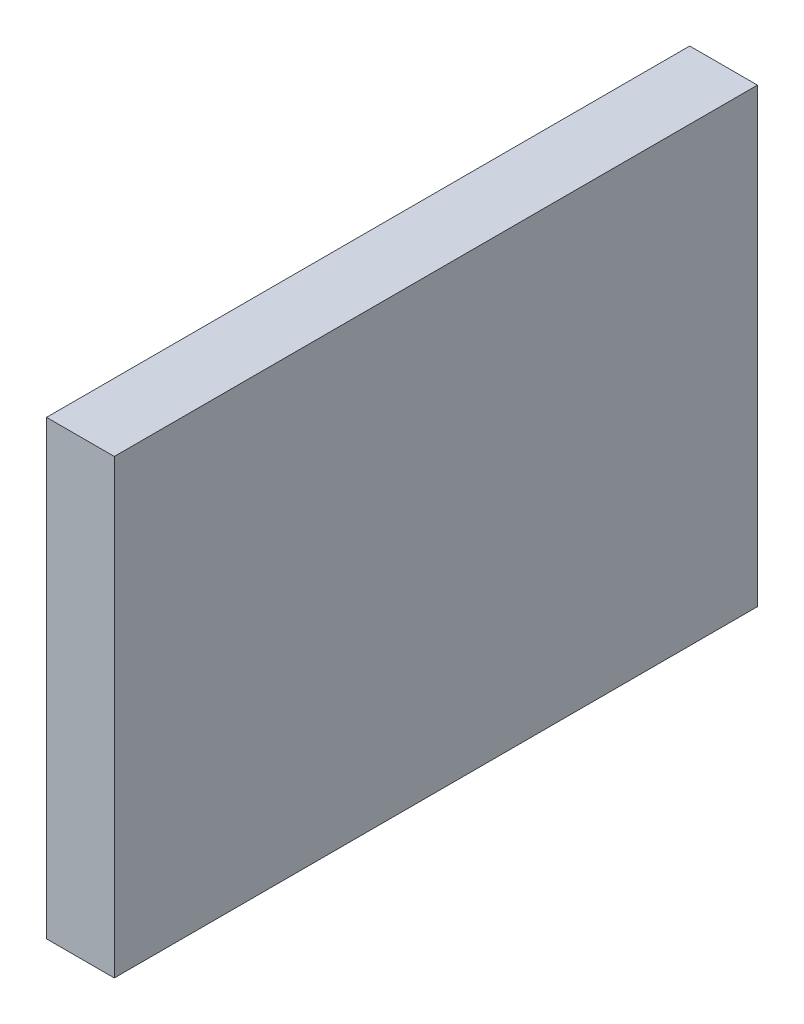
ISO-10303-21;
HEADER;
FILE_DESCRIPTION(('STEP AP214'),'2;1');
FILE_NAME('part.step','',(''),(''),'','','');
FILE_SCHEMA(('AUTOMOTIVE_DESIGN { 1 0 10303 214 1 1 1 1 }'));
ENDSEC;
DATA;
#1=APPLICATION_CONTEXT('core data for automotive mechanical design processes');
#2=APPLICATION_PROTOCOL_DEFINITION('international standard','automotive_design',2000,#1);
#3=PRODUCT_CONTEXT('',#1,'mechanical');
#4=PRODUCT('Part','Part','',(#3));
#5=PRODUCT_RELATED_PRODUCT_CATEGORY('part','',(#4));
#6=PRODUCT_DEFINITION_FORMATION('','',#4);
#7=PRODUCT_DEFINITION_CONTEXT('part definition',#1,'design');
#8=PRODUCT_DEFINITION('design','',#6,#7);
#9=PRODUCT_DEFINITION_SHAPE('','',#8);
#10=(LENGTH_UNIT() NAMED_UNIT(*) SI_UNIT(.MILLI.,.METRE.));
#11=(NAMED_UNIT(*) PLANE_ANGLE_UNIT() SI_UNIT($,.RADIAN.));
#12=(NAMED_UNIT(*) SI_UNIT($,.STERADIAN.) SOLID_ANGLE_UNIT());
#13=UNCERTAINTY_MEASURE_WITH_UNIT(LENGTH_MEASURE(1.E-05),#10,'distance_accuracy_value','');
#14=(GEOMETRIC_REPRESENTATION_CONTEXT(3) GLOBAL_UNCERTAINTY_ASSIGNED_CONTEXT((#13)) GLOBAL_UNIT_ASSIGNED_CONTEXT((#10,
#11,#12)) REPRESENTATION_CONTEXT('',''));
#15=CARTESIAN_POINT('',(0.,0.,0.));
#16=DIRECTION('',(0.,0.,1.));
#17=DIRECTION('',(1.,0.,0.));
#18=AXIS2_PLACEMENT_3D('',#15,#16,#17);
#19=CARTESIAN_POINT('',(15.,0.,0.));
#20=DIRECTION('',(0.,0.,-1.));
#21=DIRECTION('',(-1.,0.,0.));
#22=AXIS2_PLACEMENT_3D('',#19,#20,#21);
#23=PLANE('',#22);
#24=DIRECTION('',(0.,-1.,0.));
#25=VECTOR('',#24,1.);
#26=CARTESIAN_POINT('',(0.,0.,0.));
#27=LINE('',#26,#25);
#28=CARTESIAN_POINT('',(0.,100.,0.));
#29=VERTEX_POINT('',#28);
#30=CARTESIAN_POINT('',(0.,0.,0.));
#31=VERTEX_POINT('',#30);
#32=EDGE_CURVE('E96',#29,#31,#27,.T.);
#33=ORIENTED_EDGE('',*,*,#32,.T.);
#34=DIRECTION('',(-1.,0.,0.));
#35=VECTOR('',#34,1.);
#36=CARTESIAN_POINT('',(15.,0.,0.));
#37=LINE('',#36,#35);
#38=CARTESIAN_POINT('',(15.,0.,0.));
#39=VERTEX_POINT('',#38);
#40=EDGE_CURVE('E11',#39,#31,#37,.T.);
#41=ORIENTED_EDGE('',*,*,#40,.F.);
#42=DIRECTION('',(0.,-1.,0.));
#43=VECTOR('',#42,1.);
#44=CARTESIAN_POINT('',(15.,0.,0.));
#45=LINE('',#44,#43);
#46=CARTESIAN_POINT('',(15.,100.,0.));
#47=VERTEX_POINT('',#46);
#48=EDGE_CURVE('E84',#47,#39,#45,.T.);
#49=ORIENTED_EDGE('',*,*,#48,.F.);
#50=DIRECTION('',(-1.,0.,0.));
#51=VECTOR('',#50,1.);
#52=CARTESIAN_POINT('',(15.,100.,0.));
#53=LINE('',#52,#51);
#54=EDGE_CURVE('E92',#47,#29,#53,.T.);
#55=ORIENTED_EDGE('',*,*,#54,.T.);
#56=EDGE_LOOP('',(#33,#41,#49,#55));
#57=FACE_BOUND('',#56,.T.);
#58=ADVANCED_FACE('F33',(#57),#23,.F.);
#59=CARTESIAN_POINT('',(15.,0.,0.));
#60=DIRECTION('',(0.,1.,0.));
#61=DIRECTION('',(0.,0.,1.));
#62=AXIS2_PLACEMENT_3D('',#59,#60,#61);
#63=PLANE('',#62);
#64=DIRECTION('',(0.,0.,-1.));
#65=VECTOR('',#64,1.);
#66=CARTESIAN_POINT('',(0.,0.,0.));
#67=LINE('',#66,#65);
#68=CARTESIAN_POINT('',(0.,0.,-142.4));
#69=VERTEX_POINT('',#68);
#70=EDGE_CURVE('E88',#31,#69,#67,.T.);
#71=ORIENTED_EDGE('',*,*,#70,.T.);
#72=DIRECTION('',(-1.,0.,0.));
#73=VECTOR('',#72,1.);
#74=CARTESIAN_POINT('',(15.,0.,-142.4));
#75=LINE('',#74,#73);
#76=CARTESIAN_POINT('',(15.,0.,-142.4));
#77=VERTEX_POINT('',#76);
#78=EDGE_CURVE('E41',#77,#69,#75,.T.);
#79=ORIENTED_EDGE('',*,*,#78,.F.);
#80=DIRECTION('',(0.,0.,-1.));
#81=VECTOR('',#80,1.);
#82=CARTESIAN_POINT('',(15.,0.,0.));
#83=LINE('',#82,#81);
#84=EDGE_CURVE('E79',#39,#77,#83,.T.);
#85=ORIENTED_EDGE('',*,*,#84,.F.);
#86=ORIENTED_EDGE('',*,*,#40,.T.);
#87=EDGE_LOOP('',(#71,#79,#85,#86));
#88=FACE_BOUND('',#87,.T.);
#89=ADVANCED_FACE('F87',(#88),#63,.F.);
#90=CARTESIAN_POINT('',(15.,0.,-142.4));
#91=DIRECTION('',(0.,0.,1.));
#92=DIRECTION('',(1.,0.,0.));
#93=AXIS2_PLACEMENT_3D('',#90,#91,#92);
#94=PLANE('',#93);
#95=DIRECTION('',(0.,1.,0.));
#96=VECTOR('',#95,1.);
#97=CARTESIAN_POINT('',(0.,0.,-142.4));
#98=LINE('',#97,#96);
#99=CARTESIAN_POINT('',(0.,100.,-142.4));
#100=VERTEX_POINT('',#99);
#101=EDGE_CURVE('E66',#69,#100,#98,.T.);
#102=ORIENTED_EDGE('',*,*,#101,.T.);
#103=DIRECTION('',(-1.,0.,0.));
#104=VECTOR('',#103,1.);
#105=CARTESIAN_POINT('',(15.,100.,-142.4));
#106=LINE('',#105,#104);
#107=CARTESIAN_POINT('',(15.,100.,-142.4));
#108=VERTEX_POINT('',#107);
#109=EDGE_CURVE('E89',#108,#100,#106,.T.);
#110=ORIENTED_EDGE('',*,*,#109,.F.);
#111=DIRECTION('',(0.,1.,0.));
#112=VECTOR('',#111,1.);
#113=CARTESIAN_POINT('',(15.,0.,-142.4));
#114=LINE('',#113,#112);
#115=EDGE_CURVE('E82',#77,#108,#114,.T.);
#116=ORIENTED_EDGE('',*,*,#115,.F.);
#117=ORIENTED_EDGE('',*,*,#78,.T.);
#118=EDGE_LOOP('',(#102,#110,#116,#117));
#119=FACE_BOUND('',#118,.T.);
#120=ADVANCED_FACE('F90',(#119),#94,.F.);
#121=CARTESIAN_POINT('',(15.,100.,0.));
#122=DIRECTION('',(0.,-1.,0.));
#123=DIRECTION('',(0.,0.,-1.));
#124=AXIS2_PLACEMENT_3D('',#121,#122,#123);
#125=PLANE('',#124);
#126=DIRECTION('',(0.,0.,1.));
#127=VECTOR('',#126,1.);
#128=CARTESIAN_POINT('',(0.,100.,0.));
#129=LINE('',#128,#127);
#130=EDGE_CURVE('E72',#100,#29,#129,.T.);
#131=ORIENTED_EDGE('',*,*,#130,.T.);
#132=ORIENTED_EDGE('',*,*,#54,.F.);
#133=DIRECTION('',(0.,0.,1.));
#134=VECTOR('',#133,1.);
#135=CARTESIAN_POINT('',(15.,100.,0.));
#136=LINE('',#135,#134);
#137=EDGE_CURVE('E49',#108,#47,#136,.T.);
#138=ORIENTED_EDGE('',*,*,#137,.F.);
#139=ORIENTED_EDGE('',*,*,#109,.T.);
#140=EDGE_LOOP('',(#131,#132,#138,#139));
#141=FACE_BOUND('',#140,.T.);
#142=ADVANCED_FACE('F103',(#141),#125,.F.);
#143=CARTESIAN_POINT('',(15.,0.,0.));
#144=DIRECTION('',(-1.,0.,0.));
#145=DIRECTION('',(0.,0.,1.));
#146=AXIS2_PLACEMENT_3D('',#143,#144,#145);
#147=PLANE('',#146);
#148=ORIENTED_EDGE('',*,*,#48,.T.);
#149=ORIENTED_EDGE('',*,*,#84,.T.);
#150=ORIENTED_EDGE('',*,*,#115,.T.);
#151=ORIENTED_EDGE('',*,*,#137,.T.);
#152=EDGE_LOOP('',(#148,#149,#150,#151));
#153=FACE_BOUND('',#152,.T.);
#154=ADVANCED_FACE('F80',(#153),#147,.F.);
#155=CARTESIAN_POINT('',(0.,0.,0.));
#156=DIRECTION('',(-1.,0.,0.));
#157=DIRECTION('',(0.,0.,1.));
#158=AXIS2_PLACEMENT_3D('',#155,#156,#157);
#159=PLANE('',#158);
#160=ORIENTED_EDGE('',*,*,#32,.F.);
#161=ORIENTED_EDGE('',*,*,#130,.F.);
#162=ORIENTED_EDGE('',*,*,#101,.F.);
#163=ORIENTED_EDGE('',*,*,#70,.F.);
#164=EDGE_LOOP('',(#160,#161,#162,#163));
#165=FACE_BOUND('',#164,.T.);
#166=ADVANCED_FACE('F106',(#165),#159,.T.);
#167=CLOSED_SHELL('',(#58,#89,#120,#142,#154,#166));
#168=MANIFOLD_SOLID_BREP('B2',#167);
#169=ADVANCED_BREP_SHAPE_REPRESENTATION('',(#18,#168),#14);
#170=SHAPE_DEFINITION_REPRESENTATION(#9,#169);
ENDSEC;
END-ISO-10303-21;
